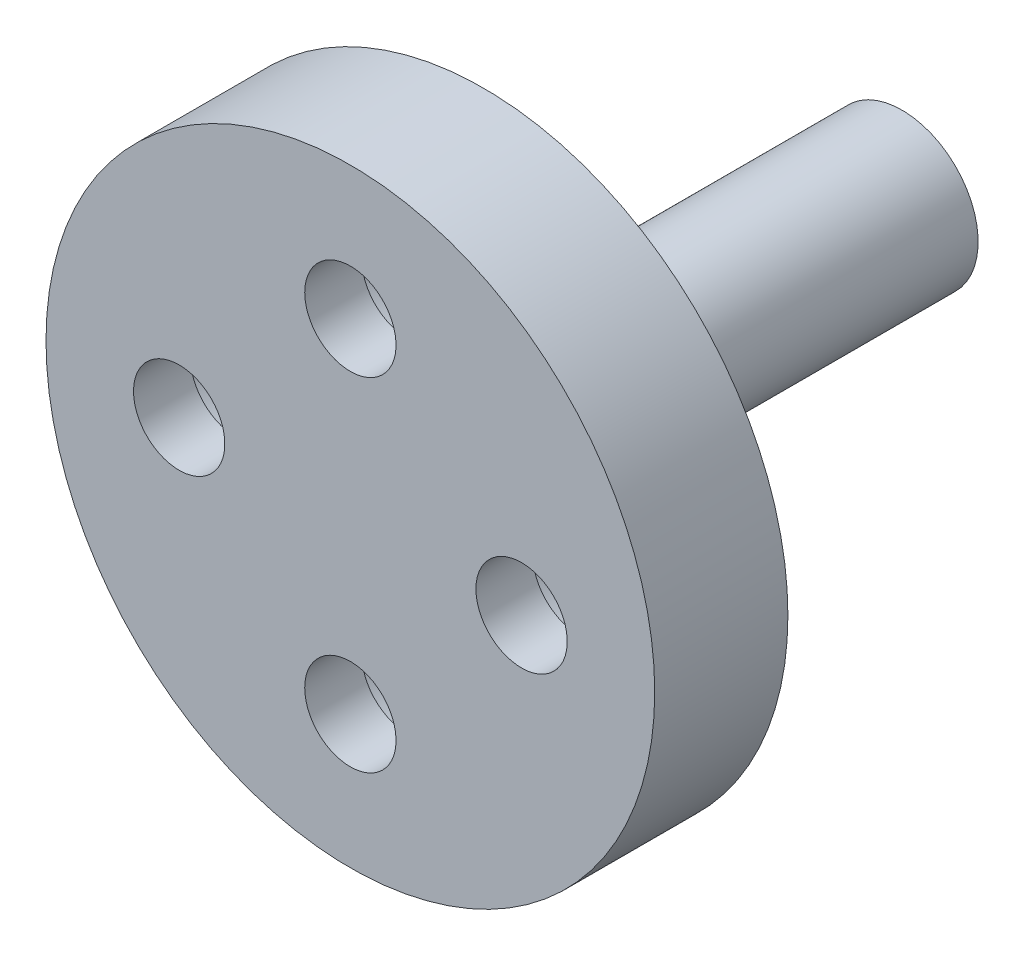
ISO-10303-21;
HEADER;
FILE_DESCRIPTION(('STEP AP214'),'2;1');
FILE_NAME('part.step','',(''),(''),'','','');
FILE_SCHEMA(('AUTOMOTIVE_DESIGN { 1 0 10303 214 1 1 1 1 }'));
ENDSEC;
DATA;
#1=APPLICATION_CONTEXT('core data for automotive mechanical design processes');
#2=APPLICATION_PROTOCOL_DEFINITION('international standard','automotive_design',2000,#1);
#3=PRODUCT_CONTEXT('',#1,'mechanical');
#4=PRODUCT('Part','Part','',(#3));
#5=PRODUCT_RELATED_PRODUCT_CATEGORY('part','',(#4));
#6=PRODUCT_DEFINITION_FORMATION('','',#4);
#7=PRODUCT_DEFINITION_CONTEXT('part definition',#1,'design');
#8=PRODUCT_DEFINITION('design','',#6,#7);
#9=PRODUCT_DEFINITION_SHAPE('','',#8);
#10=(LENGTH_UNIT() NAMED_UNIT(*) SI_UNIT(.MILLI.,.METRE.));
#11=(NAMED_UNIT(*) PLANE_ANGLE_UNIT() SI_UNIT($,.RADIAN.));
#12=(NAMED_UNIT(*) SI_UNIT($,.STERADIAN.) SOLID_ANGLE_UNIT());
#13=UNCERTAINTY_MEASURE_WITH_UNIT(LENGTH_MEASURE(1.E-05),#10,'distance_accuracy_value','');
#14=(GEOMETRIC_REPRESENTATION_CONTEXT(3) GLOBAL_UNCERTAINTY_ASSIGNED_CONTEXT((#13)) GLOBAL_UNIT_ASSIGNED_CONTEXT((#10,
#11,#12)) REPRESENTATION_CONTEXT('',''));
#15=CARTESIAN_POINT('',(0.,0.,0.));
#16=DIRECTION('',(0.,0.,1.));
#17=DIRECTION('',(1.,0.,0.));
#18=AXIS2_PLACEMENT_3D('',#15,#16,#17);
#19=CARTESIAN_POINT('',(0.,0.,0.));
#20=DIRECTION('',(0.,0.,-1.));
#21=DIRECTION('',(-1.,0.,0.));
#22=AXIS2_PLACEMENT_3D('',#19,#20,#21);
#23=PLANE('',#22);
#24=CARTESIAN_POINT('',(0.,4.5,0.));
#25=DIRECTION('',(0.,0.,-1.));
#26=DIRECTION('',(-1.,0.,0.));
#27=AXIS2_PLACEMENT_3D('',#24,#25,#26);
#28=CIRCLE('',#27,1.2);
#29=CARTESIAN_POINT('',(-1.2,4.5,0.));
#30=VERTEX_POINT('',#29);
#31=EDGE_CURVE('E126',#30,#30,#28,.T.);
#32=ORIENTED_EDGE('',*,*,#31,.T.);
#33=EDGE_LOOP('',(#32));
#34=FACE_BOUND('',#33,.T.);
#35=CARTESIAN_POINT('',(-4.5,0.,0.));
#36=DIRECTION('',(0.,0.,-1.));
#37=DIRECTION('',(-1.,0.,0.));
#38=AXIS2_PLACEMENT_3D('',#35,#36,#37);
#39=CIRCLE('',#38,1.2);
#40=CARTESIAN_POINT('',(-5.7,0.,0.));
#41=VERTEX_POINT('',#40);
#42=EDGE_CURVE('E106',#41,#41,#39,.T.);
#43=ORIENTED_EDGE('',*,*,#42,.T.);
#44=EDGE_LOOP('',(#43));
#45=FACE_BOUND('',#44,.T.);
#46=CARTESIAN_POINT('',(0.,-4.5,0.));
#47=DIRECTION('',(0.,0.,-1.));
#48=DIRECTION('',(-1.,0.,0.));
#49=AXIS2_PLACEMENT_3D('',#46,#47,#48);
#50=CIRCLE('',#49,1.2);
#51=CARTESIAN_POINT('',(-1.2,-4.5,0.));
#52=VERTEX_POINT('',#51);
#53=EDGE_CURVE('E86',#52,#52,#50,.T.);
#54=ORIENTED_EDGE('',*,*,#53,.T.);
#55=EDGE_LOOP('',(#54));
#56=FACE_BOUND('',#55,.T.);
#57=CARTESIAN_POINT('',(4.5,0.,0.));
#58=DIRECTION('',(0.,0.,-1.));
#59=DIRECTION('',(-1.,0.,0.));
#60=AXIS2_PLACEMENT_3D('',#57,#58,#59);
#61=CIRCLE('',#60,1.2);
#62=CARTESIAN_POINT('',(3.3,0.,0.));
#63=VERTEX_POINT('',#62);
#64=EDGE_CURVE('E66',#63,#63,#61,.T.);
#65=ORIENTED_EDGE('',*,*,#64,.T.);
#66=EDGE_LOOP('',(#65));
#67=FACE_BOUND('',#66,.T.);
#68=CARTESIAN_POINT('',(0.,0.,0.));
#69=DIRECTION('',(0.,0.,-1.));
#70=DIRECTION('',(-1.,0.,0.));
#71=AXIS2_PLACEMENT_3D('',#68,#69,#70);
#72=CIRCLE('',#71,8.);
#73=CARTESIAN_POINT('',(-8.,0.,0.));
#74=VERTEX_POINT('',#73);
#75=EDGE_CURVE('E10',#74,#74,#72,.T.);
#76=ORIENTED_EDGE('',*,*,#75,.F.);
#77=EDGE_LOOP('',(#76));
#78=FACE_BOUND('',#77,.T.);
#79=ADVANCED_FACE('F43',(#34,#45,#56,#67,#78),#23,.F.);
#80=CARTESIAN_POINT('',(0.,0.,-14.5));
#81=DIRECTION('',(0.,0.,-1.));
#82=DIRECTION('',(-1.,0.,0.));
#83=AXIS2_PLACEMENT_3D('',#80,#81,#82);
#84=CYLINDRICAL_SURFACE('',#83,8.);
#85=CARTESIAN_POINT('',(0.,0.,-3.5));
#86=DIRECTION('',(0.,0.,-1.));
#87=DIRECTION('',(-1.,0.,0.));
#88=AXIS2_PLACEMENT_3D('',#85,#86,#87);
#89=CIRCLE('',#88,8.);
#90=CARTESIAN_POINT('',(-8.,0.,-3.5));
#91=VERTEX_POINT('',#90);
#92=EDGE_CURVE('E50',#91,#91,#89,.T.);
#93=ORIENTED_EDGE('',*,*,#92,.F.);
#94=EDGE_LOOP('',(#93));
#95=FACE_BOUND('',#94,.T.);
#96=ORIENTED_EDGE('',*,*,#75,.T.);
#97=EDGE_LOOP('',(#96));
#98=FACE_BOUND('',#97,.T.);
#99=ADVANCED_FACE('F153',(#95,#98),#84,.T.);
#100=CARTESIAN_POINT('',(8.,0.,-3.5));
#101=DIRECTION('',(0.,0.,1.));
#102=DIRECTION('',(1.,0.,0.));
#103=AXIS2_PLACEMENT_3D('',#100,#101,#102);
#104=PLANE('',#103);
#105=CARTESIAN_POINT('',(0.,4.5,-3.5));
#106=DIRECTION('',(0.,0.,-1.));
#107=DIRECTION('',(-1.,0.,0.));
#108=AXIS2_PLACEMENT_3D('',#105,#106,#107);
#109=CIRCLE('',#108,2.225);
#110=CARTESIAN_POINT('',(-2.225,4.5,-3.5));
#111=VERTEX_POINT('',#110);
#112=EDGE_CURVE('E142',#111,#111,#109,.T.);
#113=ORIENTED_EDGE('',*,*,#112,.F.);
#114=EDGE_LOOP('',(#113));
#115=FACE_BOUND('',#114,.T.);
#116=CARTESIAN_POINT('',(-4.5,0.,-3.5));
#117=DIRECTION('',(0.,0.,-1.));
#118=DIRECTION('',(-1.,0.,0.));
#119=AXIS2_PLACEMENT_3D('',#116,#117,#118);
#120=CIRCLE('',#119,2.225);
#121=CARTESIAN_POINT('',(-6.725,0.,-3.5));
#122=VERTEX_POINT('',#121);
#123=EDGE_CURVE('E122',#122,#122,#120,.T.);
#124=ORIENTED_EDGE('',*,*,#123,.F.);
#125=EDGE_LOOP('',(#124));
#126=FACE_BOUND('',#125,.T.);
#127=CARTESIAN_POINT('',(0.,-4.5,-3.5));
#128=DIRECTION('',(0.,0.,-1.));
#129=DIRECTION('',(-1.,0.,0.));
#130=AXIS2_PLACEMENT_3D('',#127,#128,#129);
#131=CIRCLE('',#130,2.225);
#132=CARTESIAN_POINT('',(-2.225,-4.5,-3.5));
#133=VERTEX_POINT('',#132);
#134=EDGE_CURVE('E102',#133,#133,#131,.T.);
#135=ORIENTED_EDGE('',*,*,#134,.F.);
#136=EDGE_LOOP('',(#135));
#137=FACE_BOUND('',#136,.T.);
#138=CARTESIAN_POINT('',(4.5,0.,-3.5));
#139=DIRECTION('',(0.,0.,-1.));
#140=DIRECTION('',(-1.,0.,0.));
#141=AXIS2_PLACEMENT_3D('',#138,#139,#140);
#142=CIRCLE('',#141,2.225);
#143=CARTESIAN_POINT('',(2.275,0.,-3.5));
#144=VERTEX_POINT('',#143);
#145=EDGE_CURVE('E82',#144,#144,#142,.T.);
#146=ORIENTED_EDGE('',*,*,#145,.F.);
#147=EDGE_LOOP('',(#146));
#148=FACE_BOUND('',#147,.T.);
#149=CARTESIAN_POINT('',(0.,0.,-3.5));
#150=DIRECTION('',(0.,0.,-1.));
#151=DIRECTION('',(-1.,0.,0.));
#152=AXIS2_PLACEMENT_3D('',#149,#150,#151);
#153=CIRCLE('',#152,2.);
#154=CARTESIAN_POINT('',(-2.,0.,-3.5));
#155=VERTEX_POINT('',#154);
#156=EDGE_CURVE('E55',#155,#155,#153,.T.);
#157=ORIENTED_EDGE('',*,*,#156,.F.);
#158=EDGE_LOOP('',(#157));
#159=FACE_BOUND('',#158,.T.);
#160=ORIENTED_EDGE('',*,*,#92,.T.);
#161=EDGE_LOOP('',(#160));
#162=FACE_BOUND('',#161,.T.);
#163=ADVANCED_FACE('F149',(#115,#126,#137,#148,#159,#162),#104,.F.);
#164=CARTESIAN_POINT('',(0.,0.,-14.5));
#165=DIRECTION('',(0.,0.,-1.));
#166=DIRECTION('',(-1.,0.,0.));
#167=AXIS2_PLACEMENT_3D('',#164,#165,#166);
#168=CYLINDRICAL_SURFACE('',#167,2.);
#169=CARTESIAN_POINT('',(0.,0.,-14.5));
#170=DIRECTION('',(0.,0.,-1.));
#171=DIRECTION('',(-1.,0.,0.));
#172=AXIS2_PLACEMENT_3D('',#169,#170,#171);
#173=CIRCLE('',#172,2.);
#174=CARTESIAN_POINT('',(-2.,0.,-14.5));
#175=VERTEX_POINT('',#174);
#176=EDGE_CURVE('E60',#175,#175,#173,.T.);
#177=ORIENTED_EDGE('',*,*,#176,.F.);
#178=EDGE_LOOP('',(#177));
#179=FACE_BOUND('',#178,.T.);
#180=ORIENTED_EDGE('',*,*,#156,.T.);
#181=EDGE_LOOP('',(#180));
#182=FACE_BOUND('',#181,.T.);
#183=ADVANCED_FACE('F152',(#179,#182),#168,.T.);
#184=CARTESIAN_POINT('',(2.,0.,-14.5));
#185=DIRECTION('',(0.,0.,1.));
#186=DIRECTION('',(1.,0.,0.));
#187=AXIS2_PLACEMENT_3D('',#184,#185,#186);
#188=PLANE('',#187);
#189=ORIENTED_EDGE('',*,*,#176,.T.);
#190=EDGE_LOOP('',(#189));
#191=FACE_BOUND('',#190,.T.);
#192=ADVANCED_FACE('F164',(#191),#188,.F.);
#193=CARTESIAN_POINT('',(4.5,0.,-3.5));
#194=DIRECTION('',(0.,0.,-1.));
#195=DIRECTION('',(-1.,0.,0.));
#196=AXIS2_PLACEMENT_3D('',#193,#194,#195);
#197=CYLINDRICAL_SURFACE('',#196,1.2);
#198=ORIENTED_EDGE('',*,*,#64,.F.);
#199=EDGE_LOOP('',(#198));
#200=FACE_BOUND('',#199,.T.);
#201=CARTESIAN_POINT('',(4.5,0.,-1.5));
#202=DIRECTION('',(0.,0.,-1.));
#203=DIRECTION('',(-1.,0.,0.));
#204=AXIS2_PLACEMENT_3D('',#201,#202,#203);
#205=CIRCLE('',#204,1.2);
#206=CARTESIAN_POINT('',(3.3,0.,-1.5));
#207=VERTEX_POINT('',#206);
#208=EDGE_CURVE('E70',#207,#207,#205,.T.);
#209=ORIENTED_EDGE('',*,*,#208,.T.);
#210=EDGE_LOOP('',(#209));
#211=FACE_BOUND('',#210,.T.);
#212=ADVANCED_FACE('F171',(#200,#211),#197,.F.);
#213=CARTESIAN_POINT('',(6.7,0.,-1.5));
#214=DIRECTION('',(0.,0.,1.));
#215=DIRECTION('',(1.,0.,0.));
#216=AXIS2_PLACEMENT_3D('',#213,#214,#215);
#217=PLANE('',#216);
#218=ORIENTED_EDGE('',*,*,#208,.F.);
#219=EDGE_LOOP('',(#218));
#220=FACE_BOUND('',#219,.T.);
#221=CARTESIAN_POINT('',(4.5,0.,-1.5));
#222=DIRECTION('',(0.,0.,-1.));
#223=DIRECTION('',(-1.,0.,0.));
#224=AXIS2_PLACEMENT_3D('',#221,#222,#223);
#225=CIRCLE('',#224,2.2);
#226=CARTESIAN_POINT('',(2.3,0.,-1.5));
#227=VERTEX_POINT('',#226);
#228=EDGE_CURVE('E74',#227,#227,#225,.T.);
#229=ORIENTED_EDGE('',*,*,#228,.T.);
#230=EDGE_LOOP('',(#229));
#231=FACE_BOUND('',#230,.T.);
#232=ADVANCED_FACE('F191',(#220,#231),#217,.F.);
#233=CARTESIAN_POINT('',(4.5,0.,-3.5));
#234=DIRECTION('',(0.,0.,-1.));
#235=DIRECTION('',(-1.,0.,0.));
#236=AXIS2_PLACEMENT_3D('',#233,#234,#235);
#237=CYLINDRICAL_SURFACE('',#236,2.2);
#238=ORIENTED_EDGE('',*,*,#228,.F.);
#239=EDGE_LOOP('',(#238));
#240=FACE_BOUND('',#239,.T.);
#241=CARTESIAN_POINT('',(4.5,0.,-3.47902250922057));
#242=DIRECTION('',(0.,0.,-1.));
#243=DIRECTION('',(-1.,0.,0.));
#244=AXIS2_PLACEMENT_3D('',#241,#242,#243);
#245=CIRCLE('',#244,2.2);
#246=CARTESIAN_POINT('',(2.3,0.,-3.47902250922057));
#247=VERTEX_POINT('',#246);
#248=EDGE_CURVE('E78',#247,#247,#245,.T.);
#249=ORIENTED_EDGE('',*,*,#248,.T.);
#250=EDGE_LOOP('',(#249));
#251=FACE_BOUND('',#250,.T.);
#252=ADVANCED_FACE('F197',(#240,#251),#237,.F.);
#253=CARTESIAN_POINT('',(4.5,0.,-3.5));
#254=DIRECTION('',(0.,0.,-1.));
#255=DIRECTION('',(-1.,0.,0.));
#256=AXIS2_PLACEMENT_3D('',#253,#254,#255);
#257=CONICAL_SURFACE('',#256,2.225,0.872664625997179);
#258=ORIENTED_EDGE('',*,*,#248,.F.);
#259=EDGE_LOOP('',(#258));
#260=FACE_BOUND('',#259,.T.);
#261=ORIENTED_EDGE('',*,*,#145,.T.);
#262=EDGE_LOOP('',(#261));
#263=FACE_BOUND('',#262,.T.);
#264=ADVANCED_FACE('F203',(#260,#263),#257,.F.);
#265=CARTESIAN_POINT('',(0.,-4.5,-3.5));
#266=DIRECTION('',(0.,0.,-1.));
#267=DIRECTION('',(-1.,0.,0.));
#268=AXIS2_PLACEMENT_3D('',#265,#266,#267);
#269=CYLINDRICAL_SURFACE('',#268,1.2);
#270=ORIENTED_EDGE('',*,*,#53,.F.);
#271=EDGE_LOOP('',(#270));
#272=FACE_BOUND('',#271,.T.);
#273=CARTESIAN_POINT('',(0.,-4.5,-1.5));
#274=DIRECTION('',(0.,0.,-1.));
#275=DIRECTION('',(-1.,0.,0.));
#276=AXIS2_PLACEMENT_3D('',#273,#274,#275);
#277=CIRCLE('',#276,1.2);
#278=CARTESIAN_POINT('',(-1.2,-4.5,-1.5));
#279=VERTEX_POINT('',#278);
#280=EDGE_CURVE('E90',#279,#279,#277,.T.);
#281=ORIENTED_EDGE('',*,*,#280,.T.);
#282=EDGE_LOOP('',(#281));
#283=FACE_BOUND('',#282,.T.);
#284=ADVANCED_FACE('F209',(#272,#283),#269,.F.);
#285=CARTESIAN_POINT('',(2.2,-4.5,-1.5));
#286=DIRECTION('',(0.,0.,1.));
#287=DIRECTION('',(1.,0.,0.));
#288=AXIS2_PLACEMENT_3D('',#285,#286,#287);
#289=PLANE('',#288);
#290=ORIENTED_EDGE('',*,*,#280,.F.);
#291=EDGE_LOOP('',(#290));
#292=FACE_BOUND('',#291,.T.);
#293=CARTESIAN_POINT('',(0.,-4.5,-1.5));
#294=DIRECTION('',(0.,0.,-1.));
#295=DIRECTION('',(-1.,0.,0.));
#296=AXIS2_PLACEMENT_3D('',#293,#294,#295);
#297=CIRCLE('',#296,2.2);
#298=CARTESIAN_POINT('',(-2.2,-4.5,-1.5));
#299=VERTEX_POINT('',#298);
#300=EDGE_CURVE('E94',#299,#299,#297,.T.);
#301=ORIENTED_EDGE('',*,*,#300,.T.);
#302=EDGE_LOOP('',(#301));
#303=FACE_BOUND('',#302,.T.);
#304=ADVANCED_FACE('F214',(#292,#303),#289,.F.);
#305=CARTESIAN_POINT('',(0.,-4.5,-3.5));
#306=DIRECTION('',(0.,0.,-1.));
#307=DIRECTION('',(-1.,0.,0.));
#308=AXIS2_PLACEMENT_3D('',#305,#306,#307);
#309=CYLINDRICAL_SURFACE('',#308,2.2);
#310=ORIENTED_EDGE('',*,*,#300,.F.);
#311=EDGE_LOOP('',(#310));
#312=FACE_BOUND('',#311,.T.);
#313=CARTESIAN_POINT('',(0.,-4.5,-3.47902250922057));
#314=DIRECTION('',(0.,0.,-1.));
#315=DIRECTION('',(-1.,0.,0.));
#316=AXIS2_PLACEMENT_3D('',#313,#314,#315);
#317=CIRCLE('',#316,2.2);
#318=CARTESIAN_POINT('',(-2.2,-4.5,-3.47902250922057));
#319=VERTEX_POINT('',#318);
#320=EDGE_CURVE('E98',#319,#319,#317,.T.);
#321=ORIENTED_EDGE('',*,*,#320,.T.);
#322=EDGE_LOOP('',(#321));
#323=FACE_BOUND('',#322,.T.);
#324=ADVANCED_FACE('F220',(#312,#323),#309,.F.);
#325=CARTESIAN_POINT('',(0.,-4.5,-3.5));
#326=DIRECTION('',(0.,0.,-1.));
#327=DIRECTION('',(-1.,0.,0.));
#328=AXIS2_PLACEMENT_3D('',#325,#326,#327);
#329=CONICAL_SURFACE('',#328,2.225,0.87266462599717);
#330=ORIENTED_EDGE('',*,*,#320,.F.);
#331=EDGE_LOOP('',(#330));
#332=FACE_BOUND('',#331,.T.);
#333=ORIENTED_EDGE('',*,*,#134,.T.);
#334=EDGE_LOOP('',(#333));
#335=FACE_BOUND('',#334,.T.);
#336=ADVANCED_FACE('F224',(#332,#335),#329,.F.);
#337=CARTESIAN_POINT('',(-4.5,0.,-3.5));
#338=DIRECTION('',(0.,0.,-1.));
#339=DIRECTION('',(-1.,0.,0.));
#340=AXIS2_PLACEMENT_3D('',#337,#338,#339);
#341=CYLINDRICAL_SURFACE('',#340,1.2);
#342=ORIENTED_EDGE('',*,*,#42,.F.);
#343=EDGE_LOOP('',(#342));
#344=FACE_BOUND('',#343,.T.);
#345=CARTESIAN_POINT('',(-4.5,0.,-1.5));
#346=DIRECTION('',(0.,0.,-1.));
#347=DIRECTION('',(-1.,0.,0.));
#348=AXIS2_PLACEMENT_3D('',#345,#346,#347);
#349=CIRCLE('',#348,1.2);
#350=CARTESIAN_POINT('',(-5.7,0.,-1.5));
#351=VERTEX_POINT('',#350);
#352=EDGE_CURVE('E110',#351,#351,#349,.T.);
#353=ORIENTED_EDGE('',*,*,#352,.T.);
#354=EDGE_LOOP('',(#353));
#355=FACE_BOUND('',#354,.T.);
#356=ADVANCED_FACE('F228',(#344,#355),#341,.F.);
#357=CARTESIAN_POINT('',(-2.3,0.,-1.5));
#358=DIRECTION('',(0.,0.,1.));
#359=DIRECTION('',(1.,0.,0.));
#360=AXIS2_PLACEMENT_3D('',#357,#358,#359);
#361=PLANE('',#360);
#362=ORIENTED_EDGE('',*,*,#352,.F.);
#363=EDGE_LOOP('',(#362));
#364=FACE_BOUND('',#363,.T.);
#365=CARTESIAN_POINT('',(-4.5,0.,-1.5));
#366=DIRECTION('',(0.,0.,-1.));
#367=DIRECTION('',(-1.,0.,0.));
#368=AXIS2_PLACEMENT_3D('',#365,#366,#367);
#369=CIRCLE('',#368,2.2);
#370=CARTESIAN_POINT('',(-6.7,0.,-1.5));
#371=VERTEX_POINT('',#370);
#372=EDGE_CURVE('E114',#371,#371,#369,.T.);
#373=ORIENTED_EDGE('',*,*,#372,.T.);
#374=EDGE_LOOP('',(#373));
#375=FACE_BOUND('',#374,.T.);
#376=ADVANCED_FACE('F232',(#364,#375),#361,.F.);
#377=CARTESIAN_POINT('',(-4.5,0.,-3.5));
#378=DIRECTION('',(0.,0.,-1.));
#379=DIRECTION('',(-1.,0.,0.));
#380=AXIS2_PLACEMENT_3D('',#377,#378,#379);
#381=CYLINDRICAL_SURFACE('',#380,2.2);
#382=ORIENTED_EDGE('',*,*,#372,.F.);
#383=EDGE_LOOP('',(#382));
#384=FACE_BOUND('',#383,.T.);
#385=CARTESIAN_POINT('',(-4.5,0.,-3.47902250922057));
#386=DIRECTION('',(0.,0.,-1.));
#387=DIRECTION('',(-1.,0.,0.));
#388=AXIS2_PLACEMENT_3D('',#385,#386,#387);
#389=CIRCLE('',#388,2.2);
#390=CARTESIAN_POINT('',(-6.7,0.,-3.47902250922057));
#391=VERTEX_POINT('',#390);
#392=EDGE_CURVE('E118',#391,#391,#389,.T.);
#393=ORIENTED_EDGE('',*,*,#392,.T.);
#394=EDGE_LOOP('',(#393));
#395=FACE_BOUND('',#394,.T.);
#396=ADVANCED_FACE('F236',(#384,#395),#381,.F.);
#397=CARTESIAN_POINT('',(-4.5,0.,-3.5));
#398=DIRECTION('',(0.,0.,-1.));
#399=DIRECTION('',(-1.,0.,0.));
#400=AXIS2_PLACEMENT_3D('',#397,#398,#399);
#401=CONICAL_SURFACE('',#400,2.225,0.87266462599717);
#402=ORIENTED_EDGE('',*,*,#392,.F.);
#403=EDGE_LOOP('',(#402));
#404=FACE_BOUND('',#403,.T.);
#405=ORIENTED_EDGE('',*,*,#123,.T.);
#406=EDGE_LOOP('',(#405));
#407=FACE_BOUND('',#406,.T.);
#408=ADVANCED_FACE('F240',(#404,#407),#401,.F.);
#409=CARTESIAN_POINT('',(0.,4.5,-3.5));
#410=DIRECTION('',(0.,0.,-1.));
#411=DIRECTION('',(-1.,0.,0.));
#412=AXIS2_PLACEMENT_3D('',#409,#410,#411);
#413=CYLINDRICAL_SURFACE('',#412,1.2);
#414=ORIENTED_EDGE('',*,*,#31,.F.);
#415=EDGE_LOOP('',(#414));
#416=FACE_BOUND('',#415,.T.);
#417=CARTESIAN_POINT('',(0.,4.5,-1.5));
#418=DIRECTION('',(0.,0.,-1.));
#419=DIRECTION('',(-1.,0.,0.));
#420=AXIS2_PLACEMENT_3D('',#417,#418,#419);
#421=CIRCLE('',#420,1.2);
#422=CARTESIAN_POINT('',(-1.2,4.5,-1.5));
#423=VERTEX_POINT('',#422);
#424=EDGE_CURVE('E130',#423,#423,#421,.T.);
#425=ORIENTED_EDGE('',*,*,#424,.T.);
#426=EDGE_LOOP('',(#425));
#427=FACE_BOUND('',#426,.T.);
#428=ADVANCED_FACE('F244',(#416,#427),#413,.F.);
#429=CARTESIAN_POINT('',(2.2,4.5,-1.5));
#430=DIRECTION('',(0.,0.,1.));
#431=DIRECTION('',(1.,0.,0.));
#432=AXIS2_PLACEMENT_3D('',#429,#430,#431);
#433=PLANE('',#432);
#434=ORIENTED_EDGE('',*,*,#424,.F.);
#435=EDGE_LOOP('',(#434));
#436=FACE_BOUND('',#435,.T.);
#437=CARTESIAN_POINT('',(0.,4.5,-1.5));
#438=DIRECTION('',(0.,0.,-1.));
#439=DIRECTION('',(-1.,0.,0.));
#440=AXIS2_PLACEMENT_3D('',#437,#438,#439);
#441=CIRCLE('',#440,2.2);
#442=CARTESIAN_POINT('',(-2.2,4.5,-1.5));
#443=VERTEX_POINT('',#442);
#444=EDGE_CURVE('E134',#443,#443,#441,.T.);
#445=ORIENTED_EDGE('',*,*,#444,.T.);
#446=EDGE_LOOP('',(#445));
#447=FACE_BOUND('',#446,.T.);
#448=ADVANCED_FACE('F248',(#436,#447),#433,.F.);
#449=CARTESIAN_POINT('',(0.,4.5,-3.5));
#450=DIRECTION('',(0.,0.,-1.));
#451=DIRECTION('',(-1.,0.,0.));
#452=AXIS2_PLACEMENT_3D('',#449,#450,#451);
#453=CYLINDRICAL_SURFACE('',#452,2.2);
#454=ORIENTED_EDGE('',*,*,#444,.F.);
#455=EDGE_LOOP('',(#454));
#456=FACE_BOUND('',#455,.T.);
#457=CARTESIAN_POINT('',(0.,4.5,-3.47902250922057));
#458=DIRECTION('',(0.,0.,-1.));
#459=DIRECTION('',(-1.,0.,0.));
#460=AXIS2_PLACEMENT_3D('',#457,#458,#459);
#461=CIRCLE('',#460,2.2);
#462=CARTESIAN_POINT('',(-2.2,4.5,-3.47902250922057));
#463=VERTEX_POINT('',#462);
#464=EDGE_CURVE('E138',#463,#463,#461,.T.);
#465=ORIENTED_EDGE('',*,*,#464,.T.);
#466=EDGE_LOOP('',(#465));
#467=FACE_BOUND('',#466,.T.);
#468=ADVANCED_FACE('F252',(#456,#467),#453,.F.);
#469=CARTESIAN_POINT('',(0.,4.5,-3.5));
#470=DIRECTION('',(0.,0.,-1.));
#471=DIRECTION('',(-1.,0.,0.));
#472=AXIS2_PLACEMENT_3D('',#469,#470,#471);
#473=CONICAL_SURFACE('',#472,2.225,0.87266462599717);
#474=ORIENTED_EDGE('',*,*,#464,.F.);
#475=EDGE_LOOP('',(#474));
#476=FACE_BOUND('',#475,.T.);
#477=ORIENTED_EDGE('',*,*,#112,.T.);
#478=EDGE_LOOP('',(#477));
#479=FACE_BOUND('',#478,.T.);
#480=ADVANCED_FACE('F147',(#476,#479),#473,.F.);
#481=CLOSED_SHELL('',(#79,#99,#163,#183,#192,#212,#232,#252,#264,#284,#304,#324,#336,#356,#376,
#396,#408,#428,#448,#468,#480));
#482=MANIFOLD_SOLID_BREP('B2',#481);
#483=ADVANCED_BREP_SHAPE_REPRESENTATION('',(#18,#482),#14);
#484=SHAPE_DEFINITION_REPRESENTATION(#9,#483);
ENDSEC;
END-ISO-10303-21;
